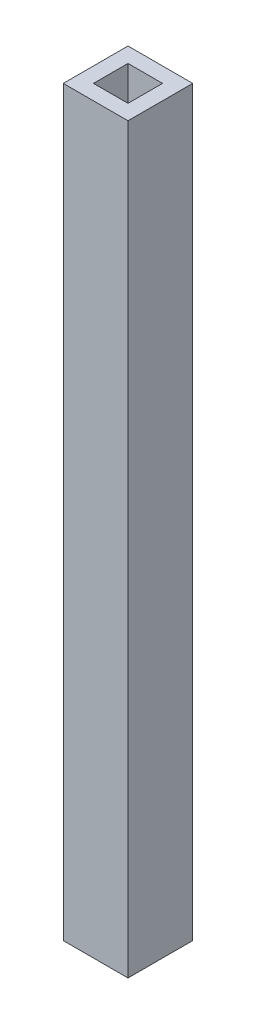
ISO-10303-21;
HEADER;
FILE_DESCRIPTION(('STEP AP214'),'2;1');
FILE_NAME('part.step','',(''),(''),'','','');
FILE_SCHEMA(('AUTOMOTIVE_DESIGN { 1 0 10303 214 1 1 1 1 }'));
ENDSEC;
DATA;
#1=APPLICATION_CONTEXT('core data for automotive mechanical design processes');
#2=APPLICATION_PROTOCOL_DEFINITION('international standard','automotive_design',2000,#1);
#3=PRODUCT_CONTEXT('',#1,'mechanical');
#4=PRODUCT('Part','Part','',(#3));
#5=PRODUCT_RELATED_PRODUCT_CATEGORY('part','',(#4));
#6=PRODUCT_DEFINITION_FORMATION('','',#4);
#7=PRODUCT_DEFINITION_CONTEXT('part definition',#1,'design');
#8=PRODUCT_DEFINITION('design','',#6,#7);
#9=PRODUCT_DEFINITION_SHAPE('','',#8);
#10=(LENGTH_UNIT() NAMED_UNIT(*) SI_UNIT(.MILLI.,.METRE.));
#11=(NAMED_UNIT(*) PLANE_ANGLE_UNIT() SI_UNIT($,.RADIAN.));
#12=(NAMED_UNIT(*) SI_UNIT($,.STERADIAN.) SOLID_ANGLE_UNIT());
#13=UNCERTAINTY_MEASURE_WITH_UNIT(LENGTH_MEASURE(1.E-05),#10,'distance_accuracy_value','');
#14=(GEOMETRIC_REPRESENTATION_CONTEXT(3) GLOBAL_UNCERTAINTY_ASSIGNED_CONTEXT((#13)) GLOBAL_UNIT_ASSIGNED_CONTEXT((#10,
#11,#12)) REPRESENTATION_CONTEXT('',''));
#15=CARTESIAN_POINT('',(0.,0.,0.));
#16=DIRECTION('',(0.,0.,1.));
#17=DIRECTION('',(1.,0.,0.));
#18=AXIS2_PLACEMENT_3D('',#15,#16,#17);
#19=CARTESIAN_POINT('',(0.,1720.,0.));
#20=DIRECTION('',(0.,1.,0.));
#21=DIRECTION('',(0.,0.,1.));
#22=AXIS2_PLACEMENT_3D('',#19,#20,#21);
#23=PLANE('',#22);
#24=DIRECTION('',(0.,0.,-1.));
#25=VECTOR('',#24,1.);
#26=CARTESIAN_POINT('',(74.9999999999997,1720.,-74.9999999999998));
#27=LINE('',#26,#25);
#28=CARTESIAN_POINT('',(74.9999999999997,1720.,75.0000000000002));
#29=VERTEX_POINT('',#28);
#30=CARTESIAN_POINT('',(74.9999999999997,1720.,-74.9999999999998));
#31=VERTEX_POINT('',#30);
#32=EDGE_CURVE('E138',#29,#31,#27,.T.);
#33=ORIENTED_EDGE('',*,*,#32,.T.);
#34=DIRECTION('',(-1.,0.,0.));
#35=VECTOR('',#34,1.);
#36=CARTESIAN_POINT('',(-75.0000000000002,1720.,-74.9999999999998));
#37=LINE('',#36,#35);
#38=CARTESIAN_POINT('',(-75.0000000000002,1720.,-74.9999999999998));
#39=VERTEX_POINT('',#38);
#40=EDGE_CURVE('E141',#31,#39,#37,.T.);
#41=ORIENTED_EDGE('',*,*,#40,.T.);
#42=DIRECTION('',(0.,0.,1.));
#43=VECTOR('',#42,1.);
#44=CARTESIAN_POINT('',(-75.0000000000002,1720.,-74.9999999999998));
#45=LINE('',#44,#43);
#46=CARTESIAN_POINT('',(-75.0000000000002,1720.,75.0000000000002));
#47=VERTEX_POINT('',#46);
#48=EDGE_CURVE('E144',#39,#47,#45,.T.);
#49=ORIENTED_EDGE('',*,*,#48,.T.);
#50=DIRECTION('',(1.,0.,0.));
#51=VECTOR('',#50,1.);
#52=CARTESIAN_POINT('',(-75.0000000000002,1720.,75.0000000000002));
#53=LINE('',#52,#51);
#54=EDGE_CURVE('E146',#47,#29,#53,.T.);
#55=ORIENTED_EDGE('',*,*,#54,.T.);
#56=EDGE_LOOP('',(#33,#41,#49,#55));
#57=FACE_BOUND('',#56,.T.);
#58=DIRECTION('',(-1.,0.,0.));
#59=VECTOR('',#58,1.);
#60=CARTESIAN_POINT('',(-40.0000000000001,1720.,-39.9999999999998));
#61=LINE('',#60,#59);
#62=CARTESIAN_POINT('',(39.9999999999999,1720.,-39.9999999999998));
#63=VERTEX_POINT('',#62);
#64=CARTESIAN_POINT('',(-40.0000000000001,1720.,-39.9999999999998));
#65=VERTEX_POINT('',#64);
#66=EDGE_CURVE('E110',#63,#65,#61,.T.);
#67=ORIENTED_EDGE('',*,*,#66,.F.);
#68=DIRECTION('',(0.,0.,-1.));
#69=VECTOR('',#68,1.);
#70=CARTESIAN_POINT('',(39.9999999999999,1720.,-39.9999999999998));
#71=LINE('',#70,#69);
#72=CARTESIAN_POINT('',(39.9999999999999,1720.,40.0000000000001));
#73=VERTEX_POINT('',#72);
#74=EDGE_CURVE('E102',#73,#63,#71,.T.);
#75=ORIENTED_EDGE('',*,*,#74,.F.);
#76=DIRECTION('',(1.,0.,0.));
#77=VECTOR('',#76,1.);
#78=CARTESIAN_POINT('',(-40.0000000000001,1720.,40.0000000000001));
#79=LINE('',#78,#77);
#80=CARTESIAN_POINT('',(-40.0000000000001,1720.,40.0000000000001));
#81=VERTEX_POINT('',#80);
#82=EDGE_CURVE('E124',#81,#73,#79,.T.);
#83=ORIENTED_EDGE('',*,*,#82,.F.);
#84=DIRECTION('',(0.,0.,1.));
#85=VECTOR('',#84,1.);
#86=CARTESIAN_POINT('',(-40.0000000000001,1720.,-39.9999999999998));
#87=LINE('',#86,#85);
#88=EDGE_CURVE('E122',#65,#81,#87,.T.);
#89=ORIENTED_EDGE('',*,*,#88,.F.);
#90=EDGE_LOOP('',(#67,#75,#83,#89));
#91=FACE_BOUND('',#90,.T.);
#92=ADVANCED_FACE('F37',(#57,#91),#23,.T.);
#93=CARTESIAN_POINT('',(0.,0.,0.));
#94=DIRECTION('',(0.,1.,0.));
#95=DIRECTION('',(0.,0.,1.));
#96=AXIS2_PLACEMENT_3D('',#93,#94,#95);
#97=PLANE('',#96);
#98=DIRECTION('',(0.,0.,-1.));
#99=VECTOR('',#98,1.);
#100=CARTESIAN_POINT('',(74.9999999999997,0.,-74.9999999999998));
#101=LINE('',#100,#99);
#102=CARTESIAN_POINT('',(74.9999999999997,0.,75.0000000000002));
#103=VERTEX_POINT('',#102);
#104=CARTESIAN_POINT('',(74.9999999999997,0.,-74.9999999999998));
#105=VERTEX_POINT('',#104);
#106=EDGE_CURVE('E118',#103,#105,#101,.T.);
#107=ORIENTED_EDGE('',*,*,#106,.F.);
#108=DIRECTION('',(1.,0.,0.));
#109=VECTOR('',#108,1.);
#110=CARTESIAN_POINT('',(-75.0000000000002,0.,75.0000000000002));
#111=LINE('',#110,#109);
#112=CARTESIAN_POINT('',(-75.0000000000002,0.,75.0000000000002));
#113=VERTEX_POINT('',#112);
#114=EDGE_CURVE('E142',#113,#103,#111,.T.);
#115=ORIENTED_EDGE('',*,*,#114,.F.);
#116=DIRECTION('',(0.,0.,1.));
#117=VECTOR('',#116,1.);
#118=CARTESIAN_POINT('',(-75.0000000000002,0.,-74.9999999999998));
#119=LINE('',#118,#117);
#120=CARTESIAN_POINT('',(-75.0000000000002,0.,-74.9999999999998));
#121=VERTEX_POINT('',#120);
#122=EDGE_CURVE('E153',#121,#113,#119,.T.);
#123=ORIENTED_EDGE('',*,*,#122,.F.);
#124=DIRECTION('',(-1.,0.,0.));
#125=VECTOR('',#124,1.);
#126=CARTESIAN_POINT('',(-75.0000000000002,0.,-74.9999999999998));
#127=LINE('',#126,#125);
#128=EDGE_CURVE('E151',#105,#121,#127,.T.);
#129=ORIENTED_EDGE('',*,*,#128,.F.);
#130=EDGE_LOOP('',(#107,#115,#123,#129));
#131=FACE_BOUND('',#130,.T.);
#132=DIRECTION('',(0.,0.,-1.));
#133=VECTOR('',#132,1.);
#134=CARTESIAN_POINT('',(39.9999999999999,0.,-39.9999999999998));
#135=LINE('',#134,#133);
#136=CARTESIAN_POINT('',(39.9999999999999,0.,40.0000000000001));
#137=VERTEX_POINT('',#136);
#138=CARTESIAN_POINT('',(39.9999999999999,0.,-39.9999999999998));
#139=VERTEX_POINT('',#138);
#140=EDGE_CURVE('E60',#137,#139,#135,.T.);
#141=ORIENTED_EDGE('',*,*,#140,.T.);
#142=DIRECTION('',(-1.,0.,0.));
#143=VECTOR('',#142,1.);
#144=CARTESIAN_POINT('',(-40.0000000000001,0.,-39.9999999999998));
#145=LINE('',#144,#143);
#146=CARTESIAN_POINT('',(-40.0000000000001,0.,-39.9999999999998));
#147=VERTEX_POINT('',#146);
#148=EDGE_CURVE('E117',#139,#147,#145,.T.);
#149=ORIENTED_EDGE('',*,*,#148,.T.);
#150=DIRECTION('',(0.,0.,1.));
#151=VECTOR('',#150,1.);
#152=CARTESIAN_POINT('',(-40.0000000000001,0.,-39.9999999999998));
#153=LINE('',#152,#151);
#154=CARTESIAN_POINT('',(-40.0000000000001,0.,40.0000000000001));
#155=VERTEX_POINT('',#154);
#156=EDGE_CURVE('E130',#147,#155,#153,.T.);
#157=ORIENTED_EDGE('',*,*,#156,.T.);
#158=DIRECTION('',(1.,0.,0.));
#159=VECTOR('',#158,1.);
#160=CARTESIAN_POINT('',(-40.0000000000001,0.,40.0000000000001));
#161=LINE('',#160,#159);
#162=EDGE_CURVE('E111',#155,#137,#161,.T.);
#163=ORIENTED_EDGE('',*,*,#162,.T.);
#164=EDGE_LOOP('',(#141,#149,#157,#163));
#165=FACE_BOUND('',#164,.T.);
#166=ADVANCED_FACE('F171',(#131,#165),#97,.F.);
#167=CARTESIAN_POINT('',(74.9999999999997,1720.,-74.9999999999998));
#168=DIRECTION('',(-1.,0.,0.));
#169=DIRECTION('',(0.,0.,1.));
#170=AXIS2_PLACEMENT_3D('',#167,#168,#169);
#171=PLANE('',#170);
#172=ORIENTED_EDGE('',*,*,#106,.T.);
#173=DIRECTION('',(0.,-1.,0.));
#174=VECTOR('',#173,1.);
#175=CARTESIAN_POINT('',(74.9999999999997,1720.,-74.9999999999998));
#176=LINE('',#175,#174);
#177=EDGE_CURVE('E11',#31,#105,#176,.T.);
#178=ORIENTED_EDGE('',*,*,#177,.F.);
#179=ORIENTED_EDGE('',*,*,#32,.F.);
#180=DIRECTION('',(0.,-1.,0.));
#181=VECTOR('',#180,1.);
#182=CARTESIAN_POINT('',(74.9999999999997,1720.,75.0000000000002));
#183=LINE('',#182,#181);
#184=EDGE_CURVE('E148',#29,#103,#183,.T.);
#185=ORIENTED_EDGE('',*,*,#184,.T.);
#186=EDGE_LOOP('',(#172,#178,#179,#185));
#187=FACE_BOUND('',#186,.T.);
#188=ADVANCED_FACE('F39',(#187),#171,.F.);
#189=CARTESIAN_POINT('',(-75.0000000000002,1720.,-74.9999999999998));
#190=DIRECTION('',(0.,0.,1.));
#191=DIRECTION('',(1.,0.,0.));
#192=AXIS2_PLACEMENT_3D('',#189,#190,#191);
#193=PLANE('',#192);
#194=ORIENTED_EDGE('',*,*,#128,.T.);
#195=DIRECTION('',(0.,-1.,0.));
#196=VECTOR('',#195,1.);
#197=CARTESIAN_POINT('',(-75.0000000000002,1720.,-74.9999999999998));
#198=LINE('',#197,#196);
#199=EDGE_CURVE('E45',#39,#121,#198,.T.);
#200=ORIENTED_EDGE('',*,*,#199,.F.);
#201=ORIENTED_EDGE('',*,*,#40,.F.);
#202=ORIENTED_EDGE('',*,*,#177,.T.);
#203=EDGE_LOOP('',(#194,#200,#201,#202));
#204=FACE_BOUND('',#203,.T.);
#205=ADVANCED_FACE('F181',(#204),#193,.F.);
#206=CARTESIAN_POINT('',(-75.0000000000002,1720.,-74.9999999999998));
#207=DIRECTION('',(1.,0.,0.));
#208=DIRECTION('',(0.,0.,-1.));
#209=AXIS2_PLACEMENT_3D('',#206,#207,#208);
#210=PLANE('',#209);
#211=ORIENTED_EDGE('',*,*,#122,.T.);
#212=DIRECTION('',(0.,-1.,0.));
#213=VECTOR('',#212,1.);
#214=CARTESIAN_POINT('',(-75.0000000000002,1720.,75.0000000000002));
#215=LINE('',#214,#213);
#216=EDGE_CURVE('E158',#47,#113,#215,.T.);
#217=ORIENTED_EDGE('',*,*,#216,.F.);
#218=ORIENTED_EDGE('',*,*,#48,.F.);
#219=ORIENTED_EDGE('',*,*,#199,.T.);
#220=EDGE_LOOP('',(#211,#217,#218,#219));
#221=FACE_BOUND('',#220,.T.);
#222=ADVANCED_FACE('F165',(#221),#210,.F.);
#223=CARTESIAN_POINT('',(-75.0000000000002,1720.,75.0000000000002));
#224=DIRECTION('',(0.,0.,-1.));
#225=DIRECTION('',(-1.,0.,0.));
#226=AXIS2_PLACEMENT_3D('',#223,#224,#225);
#227=PLANE('',#226);
#228=ORIENTED_EDGE('',*,*,#114,.T.);
#229=ORIENTED_EDGE('',*,*,#184,.F.);
#230=ORIENTED_EDGE('',*,*,#54,.F.);
#231=ORIENTED_EDGE('',*,*,#216,.T.);
#232=EDGE_LOOP('',(#228,#229,#230,#231));
#233=FACE_BOUND('',#232,.T.);
#234=ADVANCED_FACE('F175',(#233),#227,.F.);
#235=CARTESIAN_POINT('',(39.9999999999999,1720.,-39.9999999999998));
#236=DIRECTION('',(-1.,0.,0.));
#237=DIRECTION('',(0.,0.,1.));
#238=AXIS2_PLACEMENT_3D('',#235,#236,#237);
#239=PLANE('',#238);
#240=ORIENTED_EDGE('',*,*,#140,.F.);
#241=DIRECTION('',(0.,-1.,0.));
#242=VECTOR('',#241,1.);
#243=CARTESIAN_POINT('',(39.9999999999999,1720.,40.0000000000001));
#244=LINE('',#243,#242);
#245=EDGE_CURVE('E106',#73,#137,#244,.T.);
#246=ORIENTED_EDGE('',*,*,#245,.F.);
#247=ORIENTED_EDGE('',*,*,#74,.T.);
#248=DIRECTION('',(0.,-1.,0.));
#249=VECTOR('',#248,1.);
#250=CARTESIAN_POINT('',(39.9999999999999,1720.,-39.9999999999998));
#251=LINE('',#250,#249);
#252=EDGE_CURVE('E105',#63,#139,#251,.T.);
#253=ORIENTED_EDGE('',*,*,#252,.T.);
#254=EDGE_LOOP('',(#240,#246,#247,#253));
#255=FACE_BOUND('',#254,.T.);
#256=ADVANCED_FACE('F104',(#255),#239,.T.);
#257=CARTESIAN_POINT('',(-40.0000000000001,1720.,-39.9999999999998));
#258=DIRECTION('',(0.,0.,1.));
#259=DIRECTION('',(1.,0.,0.));
#260=AXIS2_PLACEMENT_3D('',#257,#258,#259);
#261=PLANE('',#260);
#262=ORIENTED_EDGE('',*,*,#148,.F.);
#263=ORIENTED_EDGE('',*,*,#252,.F.);
#264=ORIENTED_EDGE('',*,*,#66,.T.);
#265=DIRECTION('',(0.,-1.,0.));
#266=VECTOR('',#265,1.);
#267=CARTESIAN_POINT('',(-40.0000000000001,1720.,-39.9999999999998));
#268=LINE('',#267,#266);
#269=EDGE_CURVE('E119',#65,#147,#268,.T.);
#270=ORIENTED_EDGE('',*,*,#269,.T.);
#271=EDGE_LOOP('',(#262,#263,#264,#270));
#272=FACE_BOUND('',#271,.T.);
#273=ADVANCED_FACE('F114',(#272),#261,.T.);
#274=CARTESIAN_POINT('',(-40.0000000000001,1720.,-39.9999999999998));
#275=DIRECTION('',(1.,0.,0.));
#276=DIRECTION('',(0.,0.,-1.));
#277=AXIS2_PLACEMENT_3D('',#274,#275,#276);
#278=PLANE('',#277);
#279=ORIENTED_EDGE('',*,*,#156,.F.);
#280=ORIENTED_EDGE('',*,*,#269,.F.);
#281=ORIENTED_EDGE('',*,*,#88,.T.);
#282=DIRECTION('',(0.,-1.,0.));
#283=VECTOR('',#282,1.);
#284=CARTESIAN_POINT('',(-40.0000000000001,1720.,40.0000000000001));
#285=LINE('',#284,#283);
#286=EDGE_CURVE('E52',#81,#155,#285,.T.);
#287=ORIENTED_EDGE('',*,*,#286,.T.);
#288=EDGE_LOOP('',(#279,#280,#281,#287));
#289=FACE_BOUND('',#288,.T.);
#290=ADVANCED_FACE('F204',(#289),#278,.T.);
#291=CARTESIAN_POINT('',(-40.0000000000001,1720.,40.0000000000001));
#292=DIRECTION('',(0.,0.,-1.));
#293=DIRECTION('',(-1.,0.,0.));
#294=AXIS2_PLACEMENT_3D('',#291,#292,#293);
#295=PLANE('',#294);
#296=ORIENTED_EDGE('',*,*,#162,.F.);
#297=ORIENTED_EDGE('',*,*,#286,.F.);
#298=ORIENTED_EDGE('',*,*,#82,.T.);
#299=ORIENTED_EDGE('',*,*,#245,.T.);
#300=EDGE_LOOP('',(#296,#297,#298,#299));
#301=FACE_BOUND('',#300,.T.);
#302=ADVANCED_FACE('F208',(#301),#295,.T.);
#303=CLOSED_SHELL('',(#92,#166,#188,#205,#222,#234,#256,#273,#290,#302));
#304=MANIFOLD_SOLID_BREP('B2',#303);
#305=ADVANCED_BREP_SHAPE_REPRESENTATION('',(#18,#304),#14);
#306=SHAPE_DEFINITION_REPRESENTATION(#9,#305);
ENDSEC;
END-ISO-10303-21;
